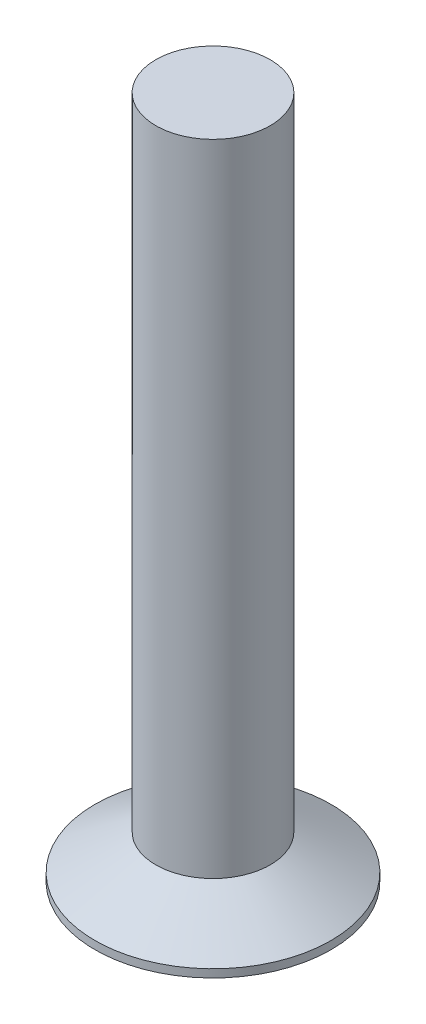
ISO-10303-21;
HEADER;
FILE_DESCRIPTION(('STEP AP214'),'2;1');
FILE_NAME('part.step','',(''),(''),'','','');
FILE_SCHEMA(('AUTOMOTIVE_DESIGN { 1 0 10303 214 1 1 1 1 }'));
ENDSEC;
DATA;
#1=APPLICATION_CONTEXT('core data for automotive mechanical design processes');
#2=APPLICATION_PROTOCOL_DEFINITION('international standard','automotive_design',2000,#1);
#3=PRODUCT_CONTEXT('',#1,'mechanical');
#4=PRODUCT('Part','Part','',(#3));
#5=PRODUCT_RELATED_PRODUCT_CATEGORY('part','',(#4));
#6=PRODUCT_DEFINITION_FORMATION('','',#4);
#7=PRODUCT_DEFINITION_CONTEXT('part definition',#1,'design');
#8=PRODUCT_DEFINITION('design','',#6,#7);
#9=PRODUCT_DEFINITION_SHAPE('','',#8);
#10=(LENGTH_UNIT() NAMED_UNIT(*) SI_UNIT(.MILLI.,.METRE.));
#11=(NAMED_UNIT(*) PLANE_ANGLE_UNIT() SI_UNIT($,.RADIAN.));
#12=(NAMED_UNIT(*) SI_UNIT($,.STERADIAN.) SOLID_ANGLE_UNIT());
#13=UNCERTAINTY_MEASURE_WITH_UNIT(LENGTH_MEASURE(1.E-05),#10,'distance_accuracy_value','');
#14=(GEOMETRIC_REPRESENTATION_CONTEXT(3) GLOBAL_UNCERTAINTY_ASSIGNED_CONTEXT((#13)) GLOBAL_UNIT_ASSIGNED_CONTEXT((#10,
#11,#12)) REPRESENTATION_CONTEXT('',''));
#15=CARTESIAN_POINT('',(0.,0.,0.));
#16=DIRECTION('',(0.,0.,1.));
#17=DIRECTION('',(1.,0.,0.));
#18=AXIS2_PLACEMENT_3D('',#15,#16,#17);
#19=CARTESIAN_POINT('',(0.00937414306125331,-37.1475369669554,0.));
#20=DIRECTION('',(0.,-1.,0.));
#21=DIRECTION('',(1.,0.,0.));
#22=AXIS2_PLACEMENT_3D('',#19,#20,#21);
#23=PLANE('',#22);
#24=CARTESIAN_POINT('',(0.00937414306123945,-37.1475369669554,0.));
#25=DIRECTION('',(0.,1.,0.));
#26=DIRECTION('',(-1.,0.,0.));
#27=AXIS2_PLACEMENT_3D('',#24,#25,#26);
#28=CIRCLE('',#27,14.75);
#29=CARTESIAN_POINT('',(-14.7406258569387,-37.1475369669554,0.));
#30=VERTEX_POINT('',#29);
#31=EDGE_CURVE('E10',#30,#30,#28,.T.);
#32=ORIENTED_EDGE('',*,*,#31,.F.);
#33=EDGE_LOOP('',(#32));
#34=FACE_BOUND('',#33,.T.);
#35=ADVANCED_FACE('F39',(#34),#23,.T.);
#36=CARTESIAN_POINT('',(0.00937414306123437,4.35991234264487,0.));
#37=DIRECTION('',(0.,1.,0.));
#38=DIRECTION('',(-1.,0.,0.));
#39=AXIS2_PLACEMENT_3D('',#36,#37,#38);
#40=CYLINDRICAL_SURFACE('',#39,14.75);
#41=ORIENTED_EDGE('',*,*,#31,.T.);
#42=EDGE_LOOP('',(#41));
#43=FACE_BOUND('',#42,.T.);
#44=CARTESIAN_POINT('',(0.00937414306123933,-36.1475369669554,0.));
#45=DIRECTION('',(0.,1.,0.));
#46=DIRECTION('',(-1.,0.,0.));
#47=AXIS2_PLACEMENT_3D('',#44,#45,#46);
#48=CIRCLE('',#47,14.75);
#49=CARTESIAN_POINT('',(-14.7406258569387,-36.1475369669554,0.));
#50=VERTEX_POINT('',#49);
#51=EDGE_CURVE('E45',#50,#50,#48,.T.);
#52=ORIENTED_EDGE('',*,*,#51,.F.);
#53=EDGE_LOOP('',(#52));
#54=FACE_BOUND('',#53,.T.);
#55=ADVANCED_FACE('F71',(#43,#54),#40,.T.);
#56=CARTESIAN_POINT('',(0.00937414306123879,-31.7596749211143,0.));
#57=DIRECTION('',(0.,-1.,0.));
#58=DIRECTION('',(1.,0.,0.));
#59=AXIS2_PLACEMENT_3D('',#56,#57,#58);
#60=CONICAL_SURFACE('',#59,7.14999999999999,1.0471975511966);
#61=ORIENTED_EDGE('',*,*,#51,.T.);
#62=EDGE_LOOP('',(#61));
#63=FACE_BOUND('',#62,.T.);
#64=CARTESIAN_POINT('',(0.00937414306123879,-31.7596749211143,0.));
#65=DIRECTION('',(0.,1.,0.));
#66=DIRECTION('',(-1.,0.,0.));
#67=AXIS2_PLACEMENT_3D('',#64,#65,#66);
#68=CIRCLE('',#67,7.14999999999999);
#69=CARTESIAN_POINT('',(-7.14062585693875,-31.7596749211143,0.));
#70=VERTEX_POINT('',#69);
#71=EDGE_CURVE('E49',#70,#70,#68,.T.);
#72=ORIENTED_EDGE('',*,*,#71,.F.);
#73=EDGE_LOOP('',(#72));
#74=FACE_BOUND('',#73,.T.);
#75=ADVANCED_FACE('F63',(#63,#74),#60,.T.);
#76=CARTESIAN_POINT('',(0.00937414306123437,4.35991234264487,0.));
#77=DIRECTION('',(0.,1.,0.));
#78=DIRECTION('',(-1.,0.,0.));
#79=AXIS2_PLACEMENT_3D('',#76,#77,#78);
#80=CYLINDRICAL_SURFACE('',#79,7.15);
#81=ORIENTED_EDGE('',*,*,#71,.T.);
#82=EDGE_LOOP('',(#81));
#83=FACE_BOUND('',#82,.T.);
#84=CARTESIAN_POINT('',(0.00937414306122899,48.2403250788857,0.));
#85=DIRECTION('',(0.,1.,0.));
#86=DIRECTION('',(-1.,0.,0.));
#87=AXIS2_PLACEMENT_3D('',#84,#85,#86);
#88=CIRCLE('',#87,7.15);
#89=CARTESIAN_POINT('',(-7.14062585693877,48.2403250788857,0.));
#90=VERTEX_POINT('',#89);
#91=EDGE_CURVE('E53',#90,#90,#88,.T.);
#92=ORIENTED_EDGE('',*,*,#91,.F.);
#93=EDGE_LOOP('',(#92));
#94=FACE_BOUND('',#93,.T.);
#95=ADVANCED_FACE('F61',(#83,#94),#80,.T.);
#96=CARTESIAN_POINT('',(-7.14062585693877,48.2403250788857,0.));
#97=DIRECTION('',(0.,1.,0.));
#98=DIRECTION('',(-1.,0.,0.));
#99=AXIS2_PLACEMENT_3D('',#96,#97,#98);
#100=PLANE('',#99);
#101=ORIENTED_EDGE('',*,*,#91,.T.);
#102=EDGE_LOOP('',(#101));
#103=FACE_BOUND('',#102,.T.);
#104=ADVANCED_FACE('F59',(#103),#100,.T.);
#105=CLOSED_SHELL('',(#35,#55,#75,#95,#104));
#106=MANIFOLD_SOLID_BREP('B2',#105);
#107=ADVANCED_BREP_SHAPE_REPRESENTATION('',(#18,#106),#14);
#108=SHAPE_DEFINITION_REPRESENTATION(#9,#107);
ENDSEC;
END-ISO-10303-21;
